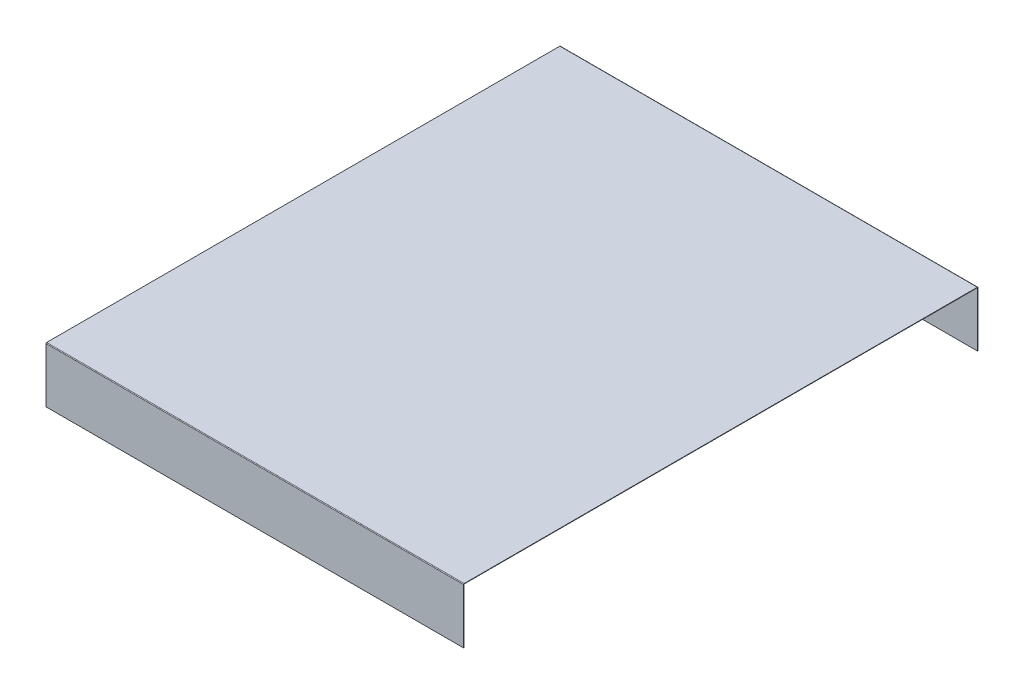
ISO-10303-21;
HEADER;
FILE_DESCRIPTION(('STEP AP214'),'2;1');
FILE_NAME('part.step','',(''),(''),'','','');
FILE_SCHEMA(('AUTOMOTIVE_DESIGN { 1 0 10303 214 1 1 1 1 }'));
ENDSEC;
DATA;
#1=APPLICATION_CONTEXT('core data for automotive mechanical design processes');
#2=APPLICATION_PROTOCOL_DEFINITION('international standard','automotive_design',2000,#1);
#3=PRODUCT_CONTEXT('',#1,'mechanical');
#4=PRODUCT('Part','Part','',(#3));
#5=PRODUCT_RELATED_PRODUCT_CATEGORY('part','',(#4));
#6=PRODUCT_DEFINITION_FORMATION('','',#4);
#7=PRODUCT_DEFINITION_CONTEXT('part definition',#1,'design');
#8=PRODUCT_DEFINITION('design','',#6,#7);
#9=PRODUCT_DEFINITION_SHAPE('','',#8);
#10=(LENGTH_UNIT() NAMED_UNIT(*) SI_UNIT(.MILLI.,.METRE.));
#11=(NAMED_UNIT(*) PLANE_ANGLE_UNIT() SI_UNIT($,.RADIAN.));
#12=(NAMED_UNIT(*) SI_UNIT($,.STERADIAN.) SOLID_ANGLE_UNIT());
#13=UNCERTAINTY_MEASURE_WITH_UNIT(LENGTH_MEASURE(1.E-05),#10,'distance_accuracy_value','');
#14=(GEOMETRIC_REPRESENTATION_CONTEXT(3) GLOBAL_UNCERTAINTY_ASSIGNED_CONTEXT((#13)) GLOBAL_UNIT_ASSIGNED_CONTEXT((#10,
#11,#12)) REPRESENTATION_CONTEXT('',''));
#15=CARTESIAN_POINT('',(0.,0.,0.));
#16=DIRECTION('',(0.,0.,1.));
#17=DIRECTION('',(1.,0.,0.));
#18=AXIS2_PLACEMENT_3D('',#15,#16,#17);
#19=CARTESIAN_POINT('',(0.,-1.214,0.));
#20=DIRECTION('',(0.,1.,0.));
#21=DIRECTION('',(0.,0.,1.));
#22=AXIS2_PLACEMENT_3D('',#19,#20,#21);
#23=PLANE('',#22);
#24=DIRECTION('',(-1.,0.,0.));
#25=VECTOR('',#24,1.);
#26=CARTESIAN_POINT('',(2.22044604925031E-13,-1.21400000000005,1501.0494));
#27=LINE('',#26,#25);
#28=CARTESIAN_POINT('',(2.1233874614452E-13,-1.21400000000005,1501.0494));
#29=VERTEX_POINT('',#28);
#30=CARTESIAN_POINT('',(1220.,-1.21400000000005,1501.0494));
#31=VERTEX_POINT('',#30);
#32=EDGE_CURVE('E224',#29,#31,#27,.F.);
#33=ORIENTED_EDGE('',*,*,#32,.F.);
#34=DIRECTION('',(0.,0.,1.));
#35=VECTOR('',#34,1.);
#36=CARTESIAN_POINT('',(0.,-1.214,0.));
#37=LINE('',#36,#35);
#38=CARTESIAN_POINT('',(0.,-1.214,1.9506));
#39=VERTEX_POINT('',#38);
#40=EDGE_CURVE('E89',#39,#29,#37,.T.);
#41=ORIENTED_EDGE('',*,*,#40,.F.);
#42=DIRECTION('',(1.,0.,0.));
#43=VECTOR('',#42,1.);
#44=CARTESIAN_POINT('',(1220.,-1.214,1.9506));
#45=LINE('',#44,#43);
#46=CARTESIAN_POINT('',(1220.,-1.214,1.9506));
#47=VERTEX_POINT('',#46);
#48=EDGE_CURVE('E275',#47,#39,#45,.F.);
#49=ORIENTED_EDGE('',*,*,#48,.F.);
#50=DIRECTION('',(0.,0.,-1.));
#51=VECTOR('',#50,1.);
#52=CARTESIAN_POINT('',(1220.,-1.214,0.));
#53=LINE('',#52,#51);
#54=EDGE_CURVE('E13',#31,#47,#53,.T.);
#55=ORIENTED_EDGE('',*,*,#54,.F.);
#56=EDGE_LOOP('',(#33,#41,#49,#55));
#57=FACE_BOUND('',#56,.T.);
#58=ADVANCED_FACE('F80',(#57),#23,.F.);
#59=CARTESIAN_POINT('',(0.,0.,0.));
#60=DIRECTION('',(0.,1.,0.));
#61=DIRECTION('',(0.,0.,1.));
#62=AXIS2_PLACEMENT_3D('',#59,#60,#61);
#63=PLANE('',#62);
#64=DIRECTION('',(0.,0.,1.));
#65=VECTOR('',#64,1.);
#66=CARTESIAN_POINT('',(0.,0.,0.));
#67=LINE('',#66,#65);
#68=CARTESIAN_POINT('',(0.,0.,1.9506));
#69=VERTEX_POINT('',#68);
#70=CARTESIAN_POINT('',(2.1233874614452E-13,0.,1501.0494));
#71=VERTEX_POINT('',#70);
#72=EDGE_CURVE('E281',#69,#71,#67,.T.);
#73=ORIENTED_EDGE('',*,*,#72,.T.);
#74=DIRECTION('',(-1.,0.,0.));
#75=VECTOR('',#74,1.);
#76=CARTESIAN_POINT('',(2.22044604925031E-13,0.,1501.0494));
#77=LINE('',#76,#75);
#78=CARTESIAN_POINT('',(1220.,0.,1501.0494));
#79=VERTEX_POINT('',#78);
#80=EDGE_CURVE('E213',#71,#79,#77,.F.);
#81=ORIENTED_EDGE('',*,*,#80,.T.);
#82=DIRECTION('',(0.,0.,-1.));
#83=VECTOR('',#82,1.);
#84=CARTESIAN_POINT('',(1220.,0.,0.));
#85=LINE('',#84,#83);
#86=CARTESIAN_POINT('',(1220.,0.,1.9506));
#87=VERTEX_POINT('',#86);
#88=EDGE_CURVE('E84',#79,#87,#85,.T.);
#89=ORIENTED_EDGE('',*,*,#88,.T.);
#90=DIRECTION('',(1.,0.,0.));
#91=VECTOR('',#90,1.);
#92=CARTESIAN_POINT('',(1220.,0.,1.9506));
#93=LINE('',#92,#91);
#94=EDGE_CURVE('E264',#87,#69,#93,.F.);
#95=ORIENTED_EDGE('',*,*,#94,.T.);
#96=EDGE_LOOP('',(#73,#81,#89,#95));
#97=FACE_BOUND('',#96,.T.);
#98=ADVANCED_FACE('F290',(#97),#63,.T.);
#99=CARTESIAN_POINT('',(0.,-1.214,0.));
#100=DIRECTION('',(-1.,0.,0.));
#101=DIRECTION('',(0.,0.,1.));
#102=AXIS2_PLACEMENT_3D('',#99,#100,#101);
#103=PLANE('',#102);
#104=ORIENTED_EDGE('',*,*,#40,.T.);
#105=DIRECTION('',(0.,1.,0.));
#106=VECTOR('',#105,1.);
#107=CARTESIAN_POINT('',(2.1233874614452E-13,-1.21400000000005,1501.0494));
#108=LINE('',#107,#106);
#109=EDGE_CURVE('E218',#29,#71,#108,.T.);
#110=ORIENTED_EDGE('',*,*,#109,.T.);
#111=ORIENTED_EDGE('',*,*,#72,.F.);
#112=DIRECTION('',(0.,1.,0.));
#113=VECTOR('',#112,1.);
#114=CARTESIAN_POINT('',(0.,-1.214,1.9506));
#115=LINE('',#114,#113);
#116=EDGE_CURVE('E279',#39,#69,#115,.T.);
#117=ORIENTED_EDGE('',*,*,#116,.F.);
#118=EDGE_LOOP('',(#104,#110,#111,#117));
#119=FACE_BOUND('',#118,.T.);
#120=ADVANCED_FACE('F82',(#119),#103,.T.);
#121=CARTESIAN_POINT('',(1220.,-1.214,0.));
#122=DIRECTION('',(1.,0.,0.));
#123=DIRECTION('',(0.,0.,-1.));
#124=AXIS2_PLACEMENT_3D('',#121,#122,#123);
#125=PLANE('',#124);
#126=DIRECTION('',(0.,1.,0.));
#127=VECTOR('',#126,1.);
#128=CARTESIAN_POINT('',(1220.,-1.21400000000005,1501.0494));
#129=LINE('',#128,#127);
#130=EDGE_CURVE('E229',#31,#79,#129,.T.);
#131=ORIENTED_EDGE('',*,*,#130,.F.);
#132=ORIENTED_EDGE('',*,*,#54,.T.);
#133=DIRECTION('',(0.,1.,0.));
#134=VECTOR('',#133,1.);
#135=CARTESIAN_POINT('',(1220.,-1.214,1.9506));
#136=LINE('',#135,#134);
#137=EDGE_CURVE('E269',#47,#87,#136,.T.);
#138=ORIENTED_EDGE('',*,*,#137,.T.);
#139=ORIENTED_EDGE('',*,*,#88,.F.);
#140=EDGE_LOOP('',(#131,#132,#138,#139));
#141=FACE_BOUND('',#140,.T.);
#142=ADVANCED_FACE('F293',(#141),#125,.T.);
#143=CARTESIAN_POINT('',(0.,-1.9506,1.9506));
#144=DIRECTION('',(-1.,0.,0.));
#145=DIRECTION('',(0.,0.,1.));
#146=AXIS2_PLACEMENT_3D('',#143,#144,#145);
#147=PLANE('',#146);
#148=DIRECTION('',(0.,0.,1.));
#149=VECTOR('',#148,1.);
#150=CARTESIAN_POINT('',(0.,-1.95059999999999,0.));
#151=LINE('',#150,#149);
#152=CARTESIAN_POINT('',(0.,-1.9506,1.214));
#153=VERTEX_POINT('',#152);
#154=CARTESIAN_POINT('',(0.,-1.9506,0.));
#155=VERTEX_POINT('',#154);
#156=EDGE_CURVE('E231',#153,#155,#151,.F.);
#157=ORIENTED_EDGE('',*,*,#156,.F.);
#158=CARTESIAN_POINT('',(0.,-1.9506,1.9506));
#159=DIRECTION('',(1.,0.,0.));
#160=DIRECTION('',(0.,0.,-1.));
#161=AXIS2_PLACEMENT_3D('',#158,#159,#160);
#162=CIRCLE('',#161,0.7366);
#163=EDGE_CURVE('E272',#39,#153,#162,.F.);
#164=ORIENTED_EDGE('',*,*,#163,.F.);
#165=ORIENTED_EDGE('',*,*,#116,.T.);
#166=CARTESIAN_POINT('',(0.,-1.9506,1.9506));
#167=DIRECTION('',(1.,0.,0.));
#168=DIRECTION('',(0.,0.,-1.));
#169=AXIS2_PLACEMENT_3D('',#166,#167,#168);
#170=CIRCLE('',#169,1.9506);
#171=EDGE_CURVE('E97',#69,#155,#170,.F.);
#172=ORIENTED_EDGE('',*,*,#171,.T.);
#173=EDGE_LOOP('',(#157,#164,#165,#172));
#174=FACE_BOUND('',#173,.T.);
#175=ADVANCED_FACE('F325',(#174),#147,.T.);
#176=CARTESIAN_POINT('',(1220.,-1.9506,1.9506));
#177=DIRECTION('',(-1.,0.,0.));
#178=DIRECTION('',(0.,0.,1.));
#179=AXIS2_PLACEMENT_3D('',#176,#177,#178);
#180=PLANE('',#179);
#181=CARTESIAN_POINT('',(1220.,-1.9506,1.9506));
#182=DIRECTION('',(1.,0.,0.));
#183=DIRECTION('',(0.,0.,-1.));
#184=AXIS2_PLACEMENT_3D('',#181,#182,#183);
#185=CIRCLE('',#184,0.7366);
#186=CARTESIAN_POINT('',(1220.,-1.9506,1.214));
#187=VERTEX_POINT('',#186);
#188=EDGE_CURVE('E237',#187,#47,#185,.T.);
#189=ORIENTED_EDGE('',*,*,#188,.F.);
#190=DIRECTION('',(0.,0.,1.));
#191=VECTOR('',#190,1.);
#192=CARTESIAN_POINT('',(1220.,-1.9506,1.214));
#193=LINE('',#192,#191);
#194=CARTESIAN_POINT('',(1220.,-1.95059999999999,0.));
#195=VERTEX_POINT('',#194);
#196=EDGE_CURVE('E257',#187,#195,#193,.F.);
#197=ORIENTED_EDGE('',*,*,#196,.T.);
#198=CARTESIAN_POINT('',(1220.,-1.9506,1.9506));
#199=DIRECTION('',(1.,0.,0.));
#200=DIRECTION('',(0.,0.,-1.));
#201=AXIS2_PLACEMENT_3D('',#198,#199,#200);
#202=CIRCLE('',#201,1.9506);
#203=EDGE_CURVE('E267',#195,#87,#202,.T.);
#204=ORIENTED_EDGE('',*,*,#203,.T.);
#205=ORIENTED_EDGE('',*,*,#137,.F.);
#206=EDGE_LOOP('',(#189,#197,#204,#205));
#207=FACE_BOUND('',#206,.T.);
#208=ADVANCED_FACE('F298',(#207),#180,.F.);
#209=CARTESIAN_POINT('',(1220.,-1.9506,1.9506));
#210=DIRECTION('',(1.,0.,0.));
#211=DIRECTION('',(0.,0.,-1.));
#212=AXIS2_PLACEMENT_3D('',#209,#210,#211);
#213=CYLINDRICAL_SURFACE('',#212,1.9506);
#214=ORIENTED_EDGE('',*,*,#94,.F.);
#215=ORIENTED_EDGE('',*,*,#203,.F.);
#216=DIRECTION('',(1.,0.,0.));
#217=VECTOR('',#216,1.);
#218=CARTESIAN_POINT('',(0.,-1.95059999999999,0.));
#219=LINE('',#218,#217);
#220=EDGE_CURVE('E255',#195,#155,#219,.F.);
#221=ORIENTED_EDGE('',*,*,#220,.T.);
#222=ORIENTED_EDGE('',*,*,#171,.F.);
#223=EDGE_LOOP('',(#214,#215,#221,#222));
#224=FACE_BOUND('',#223,.T.);
#225=ADVANCED_FACE('F323',(#224),#213,.T.);
#226=CARTESIAN_POINT('',(1220.,-1.9506,1.9506));
#227=DIRECTION('',(1.,0.,0.));
#228=DIRECTION('',(0.,0.,-1.));
#229=AXIS2_PLACEMENT_3D('',#226,#227,#228);
#230=CYLINDRICAL_SURFACE('',#229,0.7366);
#231=ORIENTED_EDGE('',*,*,#48,.T.);
#232=ORIENTED_EDGE('',*,*,#163,.T.);
#233=DIRECTION('',(1.,0.,0.));
#234=VECTOR('',#233,1.);
#235=CARTESIAN_POINT('',(0.,-1.9506,1.214));
#236=LINE('',#235,#234);
#237=EDGE_CURVE('E260',#153,#187,#236,.T.);
#238=ORIENTED_EDGE('',*,*,#237,.T.);
#239=ORIENTED_EDGE('',*,*,#188,.T.);
#240=EDGE_LOOP('',(#231,#232,#238,#239));
#241=FACE_BOUND('',#240,.T.);
#242=ADVANCED_FACE('F301',(#241),#230,.F.);
#243=CARTESIAN_POINT('',(1220.,-162.,-5.61399884912994E-13));
#244=DIRECTION('',(-1.,0.,0.));
#245=DIRECTION('',(0.,0.,1.));
#246=AXIS2_PLACEMENT_3D('',#243,#244,#245);
#247=PLANE('',#246);
#248=ORIENTED_EDGE('',*,*,#196,.F.);
#249=DIRECTION('',(0.,1.,0.));
#250=VECTOR('',#249,1.);
#251=CARTESIAN_POINT('',(1220.,-162.,1.21399999999944));
#252=LINE('',#251,#250);
#253=CARTESIAN_POINT('',(1220.,-162.,1.21399999999944));
#254=VERTEX_POINT('',#253);
#255=EDGE_CURVE('E253',#187,#254,#252,.F.);
#256=ORIENTED_EDGE('',*,*,#255,.T.);
#257=DIRECTION('',(0.,0.,1.));
#258=VECTOR('',#257,1.);
#259=CARTESIAN_POINT('',(1220.,-162.,-5.61399884912994E-13));
#260=LINE('',#259,#258);
#261=CARTESIAN_POINT('',(1220.,-162.,-5.61283168202646E-13));
#262=VERTEX_POINT('',#261);
#263=EDGE_CURVE('E234',#262,#254,#260,.T.);
#264=ORIENTED_EDGE('',*,*,#263,.F.);
#265=DIRECTION('',(0.,-1.,0.));
#266=VECTOR('',#265,1.);
#267=CARTESIAN_POINT('',(1220.,0.,0.));
#268=LINE('',#267,#266);
#269=EDGE_CURVE('E246',#195,#262,#268,.T.);
#270=ORIENTED_EDGE('',*,*,#269,.F.);
#271=EDGE_LOOP('',(#248,#256,#264,#270));
#272=FACE_BOUND('',#271,.T.);
#273=ADVANCED_FACE('F319',(#272),#247,.F.);
#274=CARTESIAN_POINT('',(0.,-1.214,0.));
#275=DIRECTION('',(1.,0.,0.));
#276=DIRECTION('',(0.,0.,-1.));
#277=AXIS2_PLACEMENT_3D('',#274,#275,#276);
#278=PLANE('',#277);
#279=ORIENTED_EDGE('',*,*,#156,.T.);
#280=DIRECTION('',(0.,1.,0.));
#281=VECTOR('',#280,1.);
#282=CARTESIAN_POINT('',(0.,0.,0.));
#283=LINE('',#282,#281);
#284=CARTESIAN_POINT('',(0.,-162.,-5.61283168202646E-13));
#285=VERTEX_POINT('',#284);
#286=EDGE_CURVE('E241',#285,#155,#283,.T.);
#287=ORIENTED_EDGE('',*,*,#286,.F.);
#288=DIRECTION('',(0.,0.,1.));
#289=VECTOR('',#288,1.);
#290=CARTESIAN_POINT('',(0.,-162.,-5.61381318547232E-13));
#291=LINE('',#290,#289);
#292=CARTESIAN_POINT('',(0.,-162.,1.21399999999944));
#293=VERTEX_POINT('',#292);
#294=EDGE_CURVE('E238',#285,#293,#291,.T.);
#295=ORIENTED_EDGE('',*,*,#294,.T.);
#296=DIRECTION('',(0.,-1.,0.));
#297=VECTOR('',#296,1.);
#298=CARTESIAN_POINT('',(0.,-1.214,1.214));
#299=LINE('',#298,#297);
#300=EDGE_CURVE('E248',#293,#153,#299,.F.);
#301=ORIENTED_EDGE('',*,*,#300,.T.);
#302=EDGE_LOOP('',(#279,#287,#295,#301));
#303=FACE_BOUND('',#302,.T.);
#304=ADVANCED_FACE('F310',(#303),#278,.F.);
#305=CARTESIAN_POINT('',(0.,0.,0.));
#306=DIRECTION('',(0.,0.,1.));
#307=DIRECTION('',(0.,-1.,0.));
#308=AXIS2_PLACEMENT_3D('',#305,#306,#307);
#309=PLANE('',#308);
#310=ORIENTED_EDGE('',*,*,#220,.F.);
#311=ORIENTED_EDGE('',*,*,#269,.T.);
#312=DIRECTION('',(-1.,0.,0.));
#313=VECTOR('',#312,1.);
#314=CARTESIAN_POINT('',(0.,-162.,-5.61283168202646E-13));
#315=LINE('',#314,#313);
#316=EDGE_CURVE('E244',#262,#285,#315,.T.);
#317=ORIENTED_EDGE('',*,*,#316,.T.);
#318=ORIENTED_EDGE('',*,*,#286,.T.);
#319=EDGE_LOOP('',(#310,#311,#317,#318));
#320=FACE_BOUND('',#319,.T.);
#321=ADVANCED_FACE('F322',(#320),#309,.F.);
#322=CARTESIAN_POINT('',(0.,0.,1.214));
#323=DIRECTION('',(0.,0.,1.));
#324=DIRECTION('',(0.,-1.,0.));
#325=AXIS2_PLACEMENT_3D('',#322,#323,#324);
#326=PLANE('',#325);
#327=ORIENTED_EDGE('',*,*,#255,.F.);
#328=ORIENTED_EDGE('',*,*,#237,.F.);
#329=ORIENTED_EDGE('',*,*,#300,.F.);
#330=DIRECTION('',(1.,0.,0.));
#331=VECTOR('',#330,1.);
#332=CARTESIAN_POINT('',(0.,-162.,1.21399999999944));
#333=LINE('',#332,#331);
#334=EDGE_CURVE('E251',#254,#293,#333,.F.);
#335=ORIENTED_EDGE('',*,*,#334,.F.);
#336=EDGE_LOOP('',(#327,#328,#329,#335));
#337=FACE_BOUND('',#336,.T.);
#338=ADVANCED_FACE('F307',(#337),#326,.T.);
#339=CARTESIAN_POINT('',(0.,-162.,-5.61399884912994E-13));
#340=DIRECTION('',(0.,1.,0.));
#341=DIRECTION('',(0.,0.,1.));
#342=AXIS2_PLACEMENT_3D('',#339,#340,#341);
#343=PLANE('',#342);
#344=ORIENTED_EDGE('',*,*,#334,.T.);
#345=ORIENTED_EDGE('',*,*,#294,.F.);
#346=ORIENTED_EDGE('',*,*,#316,.F.);
#347=ORIENTED_EDGE('',*,*,#263,.T.);
#348=EDGE_LOOP('',(#344,#345,#346,#347));
#349=FACE_BOUND('',#348,.T.);
#350=ADVANCED_FACE('F315',(#349),#343,.F.);
#351=CARTESIAN_POINT('',(1220.,-1.95060000000002,1501.0494));
#352=DIRECTION('',(1.,0.,0.));
#353=DIRECTION('',(0.,0.,-1.));
#354=AXIS2_PLACEMENT_3D('',#351,#352,#353);
#355=PLANE('',#354);
#356=DIRECTION('',(0.,0.,-1.));
#357=VECTOR('',#356,1.);
#358=CARTESIAN_POINT('',(1220.,-1.95060000000002,1503.));
#359=LINE('',#358,#357);
#360=CARTESIAN_POINT('',(1220.,-1.95060000000002,1501.786));
#361=VERTEX_POINT('',#360);
#362=CARTESIAN_POINT('',(1220.,-1.95060000000002,1503.));
#363=VERTEX_POINT('',#362);
#364=EDGE_CURVE('E195',#361,#363,#359,.F.);
#365=ORIENTED_EDGE('',*,*,#364,.F.);
#366=CARTESIAN_POINT('',(1220.,-1.95060000000002,1501.0494));
#367=DIRECTION('',(-1.,0.,0.));
#368=DIRECTION('',(0.,0.,1.));
#369=AXIS2_PLACEMENT_3D('',#366,#367,#368);
#370=CIRCLE('',#369,0.736599999999976);
#371=EDGE_CURVE('E221',#31,#361,#370,.F.);
#372=ORIENTED_EDGE('',*,*,#371,.F.);
#373=ORIENTED_EDGE('',*,*,#130,.T.);
#374=CARTESIAN_POINT('',(1220.,-1.95060000000002,1501.0494));
#375=DIRECTION('',(-1.,0.,0.));
#376=DIRECTION('',(0.,0.,1.));
#377=AXIS2_PLACEMENT_3D('',#374,#375,#376);
#378=CIRCLE('',#377,1.95059999999998);
#379=EDGE_CURVE('E105',#79,#363,#378,.F.);
#380=ORIENTED_EDGE('',*,*,#379,.T.);
#381=EDGE_LOOP('',(#365,#372,#373,#380));
#382=FACE_BOUND('',#381,.T.);
#383=ADVANCED_FACE('F337',(#382),#355,.T.);
#384=CARTESIAN_POINT('',(2.1233874614452E-13,-1.95060000000002,1501.0494));
#385=DIRECTION('',(1.,0.,0.));
#386=DIRECTION('',(0.,0.,-1.));
#387=AXIS2_PLACEMENT_3D('',#384,#385,#386);
#388=PLANE('',#387);
#389=CARTESIAN_POINT('',(2.1233874614452E-13,-1.95060000000002,1501.0494));
#390=DIRECTION('',(-1.,0.,0.));
#391=DIRECTION('',(0.,0.,1.));
#392=AXIS2_PLACEMENT_3D('',#389,#390,#391);
#393=CIRCLE('',#392,0.736599999999976);
#394=CARTESIAN_POINT('',(2.1233874614452E-13,-1.95060000000002,1501.786));
#395=VERTEX_POINT('',#394);
#396=EDGE_CURVE('E226',#395,#29,#393,.T.);
#397=ORIENTED_EDGE('',*,*,#396,.F.);
#398=DIRECTION('',(0.,0.,-1.));
#399=VECTOR('',#398,1.);
#400=CARTESIAN_POINT('',(2.22044604925031E-13,-1.95060000000002,1501.786));
#401=LINE('',#400,#399);
#402=CARTESIAN_POINT('',(2.1233874614452E-13,-1.95060000000002,1503.));
#403=VERTEX_POINT('',#402);
#404=EDGE_CURVE('E207',#395,#403,#401,.F.);
#405=ORIENTED_EDGE('',*,*,#404,.T.);
#406=CARTESIAN_POINT('',(2.1233874614452E-13,-1.95060000000002,1501.0494));
#407=DIRECTION('',(-1.,0.,0.));
#408=DIRECTION('',(0.,0.,1.));
#409=AXIS2_PLACEMENT_3D('',#406,#407,#408);
#410=CIRCLE('',#409,1.95059999999998);
#411=EDGE_CURVE('E216',#403,#71,#410,.T.);
#412=ORIENTED_EDGE('',*,*,#411,.T.);
#413=ORIENTED_EDGE('',*,*,#109,.F.);
#414=EDGE_LOOP('',(#397,#405,#412,#413));
#415=FACE_BOUND('',#414,.T.);
#416=ADVANCED_FACE('F339',(#415),#388,.F.);
#417=CARTESIAN_POINT('',(2.22044604925031E-13,-1.95060000000002,1501.0494));
#418=DIRECTION('',(-1.,0.,0.));
#419=DIRECTION('',(0.,0.,1.));
#420=AXIS2_PLACEMENT_3D('',#417,#418,#419);
#421=CYLINDRICAL_SURFACE('',#420,1.95059999999998);
#422=ORIENTED_EDGE('',*,*,#80,.F.);
#423=ORIENTED_EDGE('',*,*,#411,.F.);
#424=DIRECTION('',(-1.,0.,0.));
#425=VECTOR('',#424,1.);
#426=CARTESIAN_POINT('',(1220.,-1.95060000000002,1503.));
#427=LINE('',#426,#425);
#428=EDGE_CURVE('E205',#403,#363,#427,.F.);
#429=ORIENTED_EDGE('',*,*,#428,.T.);
#430=ORIENTED_EDGE('',*,*,#379,.F.);
#431=EDGE_LOOP('',(#422,#423,#429,#430));
#432=FACE_BOUND('',#431,.T.);
#433=ADVANCED_FACE('F345',(#432),#421,.T.);
#434=CARTESIAN_POINT('',(2.22044604925031E-13,-1.95060000000002,1501.0494));
#435=DIRECTION('',(-1.,0.,0.));
#436=DIRECTION('',(0.,0.,1.));
#437=AXIS2_PLACEMENT_3D('',#434,#435,#436);
#438=CYLINDRICAL_SURFACE('',#437,0.736599999999976);
#439=ORIENTED_EDGE('',*,*,#32,.T.);
#440=ORIENTED_EDGE('',*,*,#371,.T.);
#441=DIRECTION('',(-1.,0.,0.));
#442=VECTOR('',#441,1.);
#443=CARTESIAN_POINT('',(1220.,-1.95060000000002,1501.786));
#444=LINE('',#443,#442);
#445=EDGE_CURVE('E210',#361,#395,#444,.T.);
#446=ORIENTED_EDGE('',*,*,#445,.T.);
#447=ORIENTED_EDGE('',*,*,#396,.T.);
#448=EDGE_LOOP('',(#439,#440,#446,#447));
#449=FACE_BOUND('',#448,.T.);
#450=ADVANCED_FACE('F333',(#449),#438,.F.);
#451=CARTESIAN_POINT('',(0.,-162.,1503.));
#452=DIRECTION('',(1.,0.,0.));
#453=DIRECTION('',(0.,1.,0.));
#454=AXIS2_PLACEMENT_3D('',#451,#452,#453);
#455=PLANE('',#454);
#456=ORIENTED_EDGE('',*,*,#404,.F.);
#457=DIRECTION('',(0.,1.,0.));
#458=VECTOR('',#457,1.);
#459=CARTESIAN_POINT('',(0.,-162.,1501.786));
#460=LINE('',#459,#458);
#461=CARTESIAN_POINT('',(0.,-162.,1501.786));
#462=VERTEX_POINT('',#461);
#463=EDGE_CURVE('E203',#395,#462,#460,.F.);
#464=ORIENTED_EDGE('',*,*,#463,.T.);
#465=DIRECTION('',(0.,0.,-1.));
#466=VECTOR('',#465,1.);
#467=CARTESIAN_POINT('',(0.,-162.,1503.));
#468=LINE('',#467,#466);
#469=CARTESIAN_POINT('',(0.,-162.,1503.));
#470=VERTEX_POINT('',#469);
#471=EDGE_CURVE('E191',#470,#462,#468,.T.);
#472=ORIENTED_EDGE('',*,*,#471,.F.);
#473=DIRECTION('',(0.,-1.,0.));
#474=VECTOR('',#473,1.);
#475=CARTESIAN_POINT('',(1.8545417544886E-13,6.2311435108012E-12,1503.));
#476=LINE('',#475,#474);
#477=EDGE_CURVE('E178',#403,#470,#476,.T.);
#478=ORIENTED_EDGE('',*,*,#477,.F.);
#479=EDGE_LOOP('',(#456,#464,#472,#478));
#480=FACE_BOUND('',#479,.T.);
#481=ADVANCED_FACE('F486',(#480),#455,.F.);
#482=CARTESIAN_POINT('',(1220.,-1.214,1503.));
#483=DIRECTION('',(-1.,0.,0.));
#484=DIRECTION('',(0.,0.,1.));
#485=AXIS2_PLACEMENT_3D('',#482,#483,#484);
#486=PLANE('',#485);
#487=ORIENTED_EDGE('',*,*,#364,.T.);
#488=DIRECTION('',(0.,1.,0.));
#489=VECTOR('',#488,1.);
#490=CARTESIAN_POINT('',(1220.,6.2311435108012E-12,1503.));
#491=LINE('',#490,#489);
#492=CARTESIAN_POINT('',(1220.,-162.,1503.));
#493=VERTEX_POINT('',#492);
#494=EDGE_CURVE('E176',#493,#363,#491,.T.);
#495=ORIENTED_EDGE('',*,*,#494,.F.);
#496=DIRECTION('',(0.,0.,-1.));
#497=VECTOR('',#496,1.);
#498=CARTESIAN_POINT('',(1220.,-162.,1503.));
#499=LINE('',#498,#497);
#500=CARTESIAN_POINT('',(1220.,-162.,1501.786));
#501=VERTEX_POINT('',#500);
#502=EDGE_CURVE('E184',#493,#501,#499,.T.);
#503=ORIENTED_EDGE('',*,*,#502,.T.);
#504=DIRECTION('',(0.,-1.,0.));
#505=VECTOR('',#504,1.);
#506=CARTESIAN_POINT('',(1220.,-1.214,1501.786));
#507=LINE('',#506,#505);
#508=EDGE_CURVE('E200',#501,#361,#507,.F.);
#509=ORIENTED_EDGE('',*,*,#508,.T.);
#510=EDGE_LOOP('',(#487,#495,#503,#509));
#511=FACE_BOUND('',#510,.T.);
#512=ADVANCED_FACE('F194',(#511),#486,.F.);
#513=CARTESIAN_POINT('',(0.,6.2311435108012E-12,1503.));
#514=DIRECTION('',(0.,0.,-1.));
#515=DIRECTION('',(0.,1.,0.));
#516=AXIS2_PLACEMENT_3D('',#513,#514,#515);
#517=PLANE('',#516);
#518=ORIENTED_EDGE('',*,*,#428,.F.);
#519=ORIENTED_EDGE('',*,*,#477,.T.);
#520=DIRECTION('',(1.,0.,0.));
#521=VECTOR('',#520,1.);
#522=CARTESIAN_POINT('',(0.,-162.,1503.));
#523=LINE('',#522,#521);
#524=EDGE_CURVE('E171',#470,#493,#523,.T.);
#525=ORIENTED_EDGE('',*,*,#524,.T.);
#526=ORIENTED_EDGE('',*,*,#494,.T.);
#527=EDGE_LOOP('',(#518,#519,#525,#526));
#528=FACE_BOUND('',#527,.T.);
#529=ADVANCED_FACE('F174',(#528),#517,.F.);
#530=CARTESIAN_POINT('',(0.,6.22690485245585E-12,1501.786));
#531=DIRECTION('',(0.,0.,-1.));
#532=DIRECTION('',(0.,1.,0.));
#533=AXIS2_PLACEMENT_3D('',#530,#531,#532);
#534=PLANE('',#533);
#535=ORIENTED_EDGE('',*,*,#463,.F.);
#536=ORIENTED_EDGE('',*,*,#445,.F.);
#537=ORIENTED_EDGE('',*,*,#508,.F.);
#538=DIRECTION('',(-1.,0.,0.));
#539=VECTOR('',#538,1.);
#540=CARTESIAN_POINT('',(1220.,-162.,1501.786));
#541=LINE('',#540,#539);
#542=EDGE_CURVE('E187',#462,#501,#541,.F.);
#543=ORIENTED_EDGE('',*,*,#542,.F.);
#544=EDGE_LOOP('',(#535,#536,#537,#543));
#545=FACE_BOUND('',#544,.T.);
#546=ADVANCED_FACE('F514',(#545),#534,.T.);
#547=CARTESIAN_POINT('',(1220.,-162.,1503.));
#548=DIRECTION('',(0.,1.,0.));
#549=DIRECTION('',(0.,0.,1.));
#550=AXIS2_PLACEMENT_3D('',#547,#548,#549);
#551=PLANE('',#550);
#552=ORIENTED_EDGE('',*,*,#542,.T.);
#553=ORIENTED_EDGE('',*,*,#502,.F.);
#554=ORIENTED_EDGE('',*,*,#524,.F.);
#555=ORIENTED_EDGE('',*,*,#471,.T.);
#556=EDGE_LOOP('',(#552,#553,#554,#555));
#557=FACE_BOUND('',#556,.T.);
#558=ADVANCED_FACE('F185',(#557),#551,.F.);
#559=CLOSED_SHELL('',(#58,#98,#120,#142,#175,#208,#225,#242,#273,#304,#321,#338,#350,#383,#416,
#433,#450,#481,#512,#529,#546,#558));
#560=MANIFOLD_SOLID_BREP('B2',#559);
#561=ADVANCED_BREP_SHAPE_REPRESENTATION('',(#18,#560),#14);
#562=SHAPE_DEFINITION_REPRESENTATION(#9,#561);
ENDSEC;
END-ISO-10303-21;
